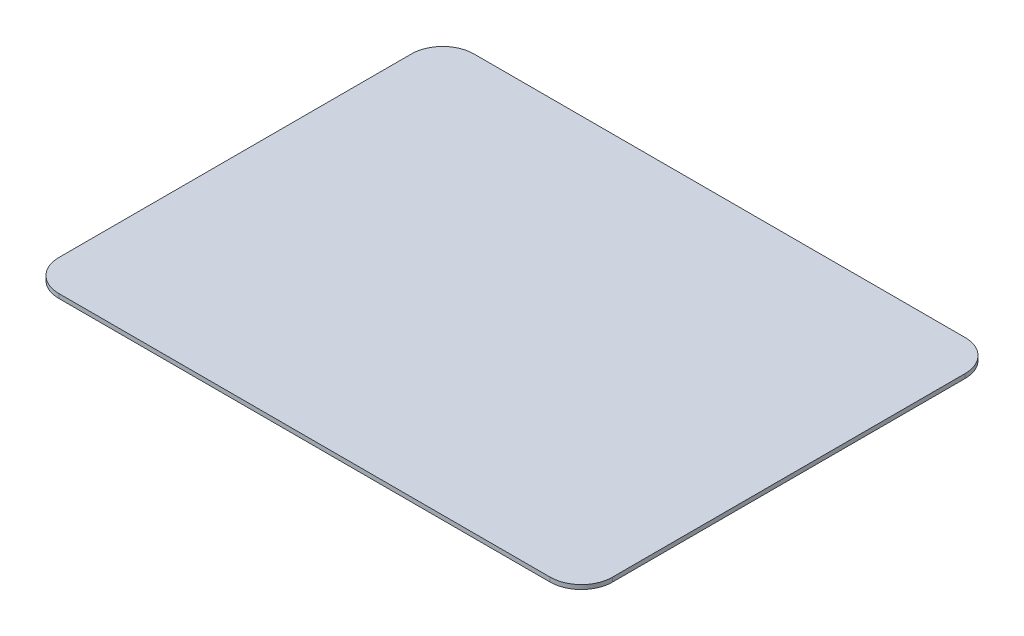
ISO-10303-21;
HEADER;
FILE_DESCRIPTION(('STEP AP214'),'2;1');
FILE_NAME('part.step','',(''),(''),'','','');
FILE_SCHEMA(('AUTOMOTIVE_DESIGN { 1 0 10303 214 1 1 1 1 }'));
ENDSEC;
DATA;
#1=APPLICATION_CONTEXT('core data for automotive mechanical design processes');
#2=APPLICATION_PROTOCOL_DEFINITION('international standard','automotive_design',2000,#1);
#3=PRODUCT_CONTEXT('',#1,'mechanical');
#4=PRODUCT('Part','Part','',(#3));
#5=PRODUCT_RELATED_PRODUCT_CATEGORY('part','',(#4));
#6=PRODUCT_DEFINITION_FORMATION('','',#4);
#7=PRODUCT_DEFINITION_CONTEXT('part definition',#1,'design');
#8=PRODUCT_DEFINITION('design','',#6,#7);
#9=PRODUCT_DEFINITION_SHAPE('','',#8);
#10=(LENGTH_UNIT() NAMED_UNIT(*) SI_UNIT(.MILLI.,.METRE.));
#11=(NAMED_UNIT(*) PLANE_ANGLE_UNIT() SI_UNIT($,.RADIAN.));
#12=(NAMED_UNIT(*) SI_UNIT($,.STERADIAN.) SOLID_ANGLE_UNIT());
#13=UNCERTAINTY_MEASURE_WITH_UNIT(LENGTH_MEASURE(1.E-05),#10,'distance_accuracy_value','');
#14=(GEOMETRIC_REPRESENTATION_CONTEXT(3) GLOBAL_UNCERTAINTY_ASSIGNED_CONTEXT((#13)) GLOBAL_UNIT_ASSIGNED_CONTEXT((#10,
#11,#12)) REPRESENTATION_CONTEXT('',''));
#15=CARTESIAN_POINT('',(0.,0.,0.));
#16=DIRECTION('',(0.,0.,1.));
#17=DIRECTION('',(1.,0.,0.));
#18=AXIS2_PLACEMENT_3D('',#15,#16,#17);
#19=CARTESIAN_POINT('',(146.6469,2.286,-109.9312));
#20=DIRECTION('',(-1.,0.,0.));
#21=DIRECTION('',(0.,0.,1.));
#22=AXIS2_PLACEMENT_3D('',#19,#20,#21);
#23=PLANE('',#22);
#24=DIRECTION('',(0.,0.,-1.));
#25=VECTOR('',#24,1.);
#26=CARTESIAN_POINT('',(146.6469,0.,-109.9312));
#27=LINE('',#26,#25);
#28=CARTESIAN_POINT('',(146.6469,0.,93.4212));
#29=VERTEX_POINT('',#28);
#30=CARTESIAN_POINT('',(146.6469,0.,-93.4212));
#31=VERTEX_POINT('',#30);
#32=EDGE_CURVE('E142',#29,#31,#27,.T.);
#33=ORIENTED_EDGE('',*,*,#32,.T.);
#34=DIRECTION('',(0.,-1.,0.));
#35=VECTOR('',#34,1.);
#36=CARTESIAN_POINT('',(146.6469,2.286,-93.4212));
#37=LINE('',#36,#35);
#38=CARTESIAN_POINT('',(146.6469,2.286,-93.4212));
#39=VERTEX_POINT('',#38);
#40=EDGE_CURVE('E175',#31,#39,#37,.F.);
#41=ORIENTED_EDGE('',*,*,#40,.T.);
#42=DIRECTION('',(0.,0.,-1.));
#43=VECTOR('',#42,1.);
#44=CARTESIAN_POINT('',(146.6469,2.286,-109.9312));
#45=LINE('',#44,#43);
#46=CARTESIAN_POINT('',(146.6469,2.286,93.4212));
#47=VERTEX_POINT('',#46);
#48=EDGE_CURVE('E140',#47,#39,#45,.T.);
#49=ORIENTED_EDGE('',*,*,#48,.F.);
#50=DIRECTION('',(0.,-1.,0.));
#51=VECTOR('',#50,1.);
#52=CARTESIAN_POINT('',(146.6469,2.286,93.4212));
#53=LINE('',#52,#51);
#54=EDGE_CURVE('E171',#47,#29,#53,.T.);
#55=ORIENTED_EDGE('',*,*,#54,.T.);
#56=EDGE_LOOP('',(#33,#41,#49,#55));
#57=FACE_BOUND('',#56,.T.);
#58=ADVANCED_FACE('F39',(#57),#23,.F.);
#59=CARTESIAN_POINT('',(-146.6469,2.286,-109.9312));
#60=DIRECTION('',(0.,0.,1.));
#61=DIRECTION('',(1.,0.,0.));
#62=AXIS2_PLACEMENT_3D('',#59,#60,#61);
#63=PLANE('',#62);
#64=DIRECTION('',(-1.,0.,0.));
#65=VECTOR('',#64,1.);
#66=CARTESIAN_POINT('',(-146.6469,0.,-109.9312));
#67=LINE('',#66,#65);
#68=CARTESIAN_POINT('',(130.1369,0.,-109.9312));
#69=VERTEX_POINT('',#68);
#70=CARTESIAN_POINT('',(-130.1369,0.,-109.9312));
#71=VERTEX_POINT('',#70);
#72=EDGE_CURVE('E136',#69,#71,#67,.T.);
#73=ORIENTED_EDGE('',*,*,#72,.T.);
#74=DIRECTION('',(0.,-1.,0.));
#75=VECTOR('',#74,1.);
#76=CARTESIAN_POINT('',(-130.1369,2.286,-109.9312));
#77=LINE('',#76,#75);
#78=CARTESIAN_POINT('',(-130.1369,2.286,-109.9312));
#79=VERTEX_POINT('',#78);
#80=EDGE_CURVE('E111',#71,#79,#77,.F.);
#81=ORIENTED_EDGE('',*,*,#80,.T.);
#82=DIRECTION('',(-1.,0.,0.));
#83=VECTOR('',#82,1.);
#84=CARTESIAN_POINT('',(-146.6469,2.286,-109.9312));
#85=LINE('',#84,#83);
#86=CARTESIAN_POINT('',(130.1369,2.286,-109.9312));
#87=VERTEX_POINT('',#86);
#88=EDGE_CURVE('E182',#87,#79,#85,.T.);
#89=ORIENTED_EDGE('',*,*,#88,.F.);
#90=DIRECTION('',(0.,-1.,0.));
#91=VECTOR('',#90,1.);
#92=CARTESIAN_POINT('',(130.1369,2.286,-109.9312));
#93=LINE('',#92,#91);
#94=EDGE_CURVE('E117',#87,#69,#93,.T.);
#95=ORIENTED_EDGE('',*,*,#94,.T.);
#96=EDGE_LOOP('',(#73,#81,#89,#95));
#97=FACE_BOUND('',#96,.T.);
#98=ADVANCED_FACE('F203',(#97),#63,.F.);
#99=CARTESIAN_POINT('',(-146.6469,2.286,-109.9312));
#100=DIRECTION('',(1.,0.,0.));
#101=DIRECTION('',(0.,0.,-1.));
#102=AXIS2_PLACEMENT_3D('',#99,#100,#101);
#103=PLANE('',#102);
#104=DIRECTION('',(0.,0.,1.));
#105=VECTOR('',#104,1.);
#106=CARTESIAN_POINT('',(-146.6469,2.286,-109.9312));
#107=LINE('',#106,#105);
#108=CARTESIAN_POINT('',(-146.6469,2.286,-93.4212));
#109=VERTEX_POINT('',#108);
#110=CARTESIAN_POINT('',(-146.6469,2.286,93.4212));
#111=VERTEX_POINT('',#110);
#112=EDGE_CURVE('E126',#109,#111,#107,.T.);
#113=ORIENTED_EDGE('',*,*,#112,.F.);
#114=DIRECTION('',(0.,-1.,0.));
#115=VECTOR('',#114,1.);
#116=CARTESIAN_POINT('',(-146.6469,2.286,-93.4212));
#117=LINE('',#116,#115);
#118=CARTESIAN_POINT('',(-146.6469,0.,-93.4212));
#119=VERTEX_POINT('',#118);
#120=EDGE_CURVE('E110',#109,#119,#117,.T.);
#121=ORIENTED_EDGE('',*,*,#120,.T.);
#122=DIRECTION('',(0.,0.,1.));
#123=VECTOR('',#122,1.);
#124=CARTESIAN_POINT('',(-146.6469,0.,-109.9312));
#125=LINE('',#124,#123);
#126=CARTESIAN_POINT('',(-146.6469,0.,93.4212));
#127=VERTEX_POINT('',#126);
#128=EDGE_CURVE('E124',#119,#127,#125,.T.);
#129=ORIENTED_EDGE('',*,*,#128,.T.);
#130=DIRECTION('',(0.,-1.,0.));
#131=VECTOR('',#130,1.);
#132=CARTESIAN_POINT('',(-146.6469,2.286,93.4212));
#133=LINE('',#132,#131);
#134=EDGE_CURVE('E129',#127,#111,#133,.F.);
#135=ORIENTED_EDGE('',*,*,#134,.T.);
#136=EDGE_LOOP('',(#113,#121,#129,#135));
#137=FACE_BOUND('',#136,.T.);
#138=ADVANCED_FACE('F123',(#137),#103,.F.);
#139=CARTESIAN_POINT('',(-146.6469,2.286,109.9312));
#140=DIRECTION('',(0.,0.,-1.));
#141=DIRECTION('',(-1.,0.,0.));
#142=AXIS2_PLACEMENT_3D('',#139,#140,#141);
#143=PLANE('',#142);
#144=DIRECTION('',(1.,0.,0.));
#145=VECTOR('',#144,1.);
#146=CARTESIAN_POINT('',(-146.6469,2.286,109.9312));
#147=LINE('',#146,#145);
#148=CARTESIAN_POINT('',(-130.1369,2.286,109.9312));
#149=VERTEX_POINT('',#148);
#150=CARTESIAN_POINT('',(130.1369,2.286,109.9312));
#151=VERTEX_POINT('',#150);
#152=EDGE_CURVE('E147',#149,#151,#147,.T.);
#153=ORIENTED_EDGE('',*,*,#152,.F.);
#154=DIRECTION('',(0.,-1.,0.));
#155=VECTOR('',#154,1.);
#156=CARTESIAN_POINT('',(-130.1369,2.286,109.9312));
#157=LINE('',#156,#155);
#158=CARTESIAN_POINT('',(-130.1369,0.,109.9312));
#159=VERTEX_POINT('',#158);
#160=EDGE_CURVE('E11',#149,#159,#157,.T.);
#161=ORIENTED_EDGE('',*,*,#160,.T.);
#162=DIRECTION('',(1.,0.,0.));
#163=VECTOR('',#162,1.);
#164=CARTESIAN_POINT('',(-146.6469,0.,109.9312));
#165=LINE('',#164,#163);
#166=CARTESIAN_POINT('',(130.1369,0.,109.9312));
#167=VERTEX_POINT('',#166);
#168=EDGE_CURVE('E135',#159,#167,#165,.T.);
#169=ORIENTED_EDGE('',*,*,#168,.T.);
#170=DIRECTION('',(0.,-1.,0.));
#171=VECTOR('',#170,1.);
#172=CARTESIAN_POINT('',(130.1369,2.286,109.9312));
#173=LINE('',#172,#171);
#174=EDGE_CURVE('E48',#167,#151,#173,.F.);
#175=ORIENTED_EDGE('',*,*,#174,.T.);
#176=EDGE_LOOP('',(#153,#161,#169,#175));
#177=FACE_BOUND('',#176,.T.);
#178=ADVANCED_FACE('F210',(#177),#143,.F.);
#179=CARTESIAN_POINT('',(0.,2.286,0.));
#180=DIRECTION('',(0.,1.,0.));
#181=DIRECTION('',(0.,0.,1.));
#182=AXIS2_PLACEMENT_3D('',#179,#180,#181);
#183=PLANE('',#182);
#184=ORIENTED_EDGE('',*,*,#88,.T.);
#185=CARTESIAN_POINT('',(-130.1369,2.286,-93.4212));
#186=DIRECTION('',(0.,1.,0.));
#187=DIRECTION('',(0.,0.,1.));
#188=AXIS2_PLACEMENT_3D('',#185,#186,#187);
#189=CIRCLE('',#188,16.51);
#190=EDGE_CURVE('E168',#79,#109,#189,.T.);
#191=ORIENTED_EDGE('',*,*,#190,.T.);
#192=ORIENTED_EDGE('',*,*,#112,.T.);
#193=CARTESIAN_POINT('',(-130.1369,2.286,93.4212));
#194=DIRECTION('',(0.,1.,0.));
#195=DIRECTION('',(0.,0.,1.));
#196=AXIS2_PLACEMENT_3D('',#193,#194,#195);
#197=CIRCLE('',#196,16.51);
#198=EDGE_CURVE('E61',#111,#149,#197,.T.);
#199=ORIENTED_EDGE('',*,*,#198,.T.);
#200=ORIENTED_EDGE('',*,*,#152,.T.);
#201=CARTESIAN_POINT('',(130.1369,2.286,93.4212));
#202=DIRECTION('',(0.,1.,0.));
#203=DIRECTION('',(0.,0.,1.));
#204=AXIS2_PLACEMENT_3D('',#201,#202,#203);
#205=CIRCLE('',#204,16.51);
#206=EDGE_CURVE('E160',#151,#47,#205,.T.);
#207=ORIENTED_EDGE('',*,*,#206,.T.);
#208=ORIENTED_EDGE('',*,*,#48,.T.);
#209=CARTESIAN_POINT('',(130.1369,2.286,-93.4212));
#210=DIRECTION('',(0.,1.,0.));
#211=DIRECTION('',(0.,0.,1.));
#212=AXIS2_PLACEMENT_3D('',#209,#210,#211);
#213=CIRCLE('',#212,16.51);
#214=EDGE_CURVE('E165',#39,#87,#213,.T.);
#215=ORIENTED_EDGE('',*,*,#214,.T.);
#216=EDGE_LOOP('',(#184,#191,#192,#199,#200,#207,#208,#215));
#217=FACE_BOUND('',#216,.T.);
#218=ADVANCED_FACE('F201',(#217),#183,.T.);
#219=CARTESIAN_POINT('',(0.,0.,0.));
#220=DIRECTION('',(0.,1.,0.));
#221=DIRECTION('',(0.,0.,1.));
#222=AXIS2_PLACEMENT_3D('',#219,#220,#221);
#223=PLANE('',#222);
#224=ORIENTED_EDGE('',*,*,#128,.F.);
#225=CARTESIAN_POINT('',(-130.1369,0.,-93.4212));
#226=DIRECTION('',(0.,1.,0.));
#227=DIRECTION('',(0.,0.,1.));
#228=AXIS2_PLACEMENT_3D('',#225,#226,#227);
#229=CIRCLE('',#228,16.51);
#230=EDGE_CURVE('E106',#119,#71,#229,.F.);
#231=ORIENTED_EDGE('',*,*,#230,.T.);
#232=ORIENTED_EDGE('',*,*,#72,.F.);
#233=CARTESIAN_POINT('',(130.1369,0.,-93.4212));
#234=DIRECTION('',(0.,1.,0.));
#235=DIRECTION('',(0.,0.,1.));
#236=AXIS2_PLACEMENT_3D('',#233,#234,#235);
#237=CIRCLE('',#236,16.51);
#238=EDGE_CURVE('E118',#69,#31,#237,.F.);
#239=ORIENTED_EDGE('',*,*,#238,.T.);
#240=ORIENTED_EDGE('',*,*,#32,.F.);
#241=CARTESIAN_POINT('',(130.1369,0.,93.4212));
#242=DIRECTION('',(0.,1.,0.));
#243=DIRECTION('',(0.,0.,1.));
#244=AXIS2_PLACEMENT_3D('',#241,#242,#243);
#245=CIRCLE('',#244,16.51);
#246=EDGE_CURVE('E128',#29,#167,#245,.F.);
#247=ORIENTED_EDGE('',*,*,#246,.T.);
#248=ORIENTED_EDGE('',*,*,#168,.F.);
#249=CARTESIAN_POINT('',(-130.1369,0.,93.4212));
#250=DIRECTION('',(0.,1.,0.));
#251=DIRECTION('',(0.,0.,1.));
#252=AXIS2_PLACEMENT_3D('',#249,#250,#251);
#253=CIRCLE('',#252,16.51);
#254=EDGE_CURVE('E133',#159,#127,#253,.F.);
#255=ORIENTED_EDGE('',*,*,#254,.T.);
#256=EDGE_LOOP('',(#224,#231,#232,#239,#240,#247,#248,#255));
#257=FACE_BOUND('',#256,.T.);
#258=ADVANCED_FACE('F131',(#257),#223,.F.);
#259=CARTESIAN_POINT('',(-130.1369,2.286,-93.4212));
#260=DIRECTION('',(0.,-1.,0.));
#261=DIRECTION('',(0.,0.,-1.));
#262=AXIS2_PLACEMENT_3D('',#259,#260,#261);
#263=CYLINDRICAL_SURFACE('',#262,16.51);
#264=ORIENTED_EDGE('',*,*,#190,.F.);
#265=ORIENTED_EDGE('',*,*,#80,.F.);
#266=ORIENTED_EDGE('',*,*,#230,.F.);
#267=ORIENTED_EDGE('',*,*,#120,.F.);
#268=EDGE_LOOP('',(#264,#265,#266,#267));
#269=FACE_BOUND('',#268,.T.);
#270=ADVANCED_FACE('F109',(#269),#263,.T.);
#271=CARTESIAN_POINT('',(130.1369,2.286,-93.4212));
#272=DIRECTION('',(0.,-1.,0.));
#273=DIRECTION('',(0.,0.,-1.));
#274=AXIS2_PLACEMENT_3D('',#271,#272,#273);
#275=CYLINDRICAL_SURFACE('',#274,16.51);
#276=ORIENTED_EDGE('',*,*,#214,.F.);
#277=ORIENTED_EDGE('',*,*,#40,.F.);
#278=ORIENTED_EDGE('',*,*,#238,.F.);
#279=ORIENTED_EDGE('',*,*,#94,.F.);
#280=EDGE_LOOP('',(#276,#277,#278,#279));
#281=FACE_BOUND('',#280,.T.);
#282=ADVANCED_FACE('F198',(#281),#275,.T.);
#283=CARTESIAN_POINT('',(-130.1369,2.286,93.4212));
#284=DIRECTION('',(0.,-1.,0.));
#285=DIRECTION('',(0.,0.,-1.));
#286=AXIS2_PLACEMENT_3D('',#283,#284,#285);
#287=CYLINDRICAL_SURFACE('',#286,16.51);
#288=ORIENTED_EDGE('',*,*,#198,.F.);
#289=ORIENTED_EDGE('',*,*,#134,.F.);
#290=ORIENTED_EDGE('',*,*,#254,.F.);
#291=ORIENTED_EDGE('',*,*,#160,.F.);
#292=EDGE_LOOP('',(#288,#289,#290,#291));
#293=FACE_BOUND('',#292,.T.);
#294=ADVANCED_FACE('F218',(#293),#287,.T.);
#295=CARTESIAN_POINT('',(130.1369,2.286,93.4212));
#296=DIRECTION('',(0.,-1.,0.));
#297=DIRECTION('',(0.,0.,-1.));
#298=AXIS2_PLACEMENT_3D('',#295,#296,#297);
#299=CYLINDRICAL_SURFACE('',#298,16.51);
#300=ORIENTED_EDGE('',*,*,#206,.F.);
#301=ORIENTED_EDGE('',*,*,#174,.F.);
#302=ORIENTED_EDGE('',*,*,#246,.F.);
#303=ORIENTED_EDGE('',*,*,#54,.F.);
#304=EDGE_LOOP('',(#300,#301,#302,#303));
#305=FACE_BOUND('',#304,.T.);
#306=ADVANCED_FACE('F41',(#305),#299,.T.);
#307=CLOSED_SHELL('',(#58,#98,#138,#178,#218,#258,#270,#282,#294,#306));
#308=MANIFOLD_SOLID_BREP('B2',#307);
#309=ADVANCED_BREP_SHAPE_REPRESENTATION('',(#18,#308),#14);
#310=SHAPE_DEFINITION_REPRESENTATION(#9,#309);
ENDSEC;
END-ISO-10303-21;
